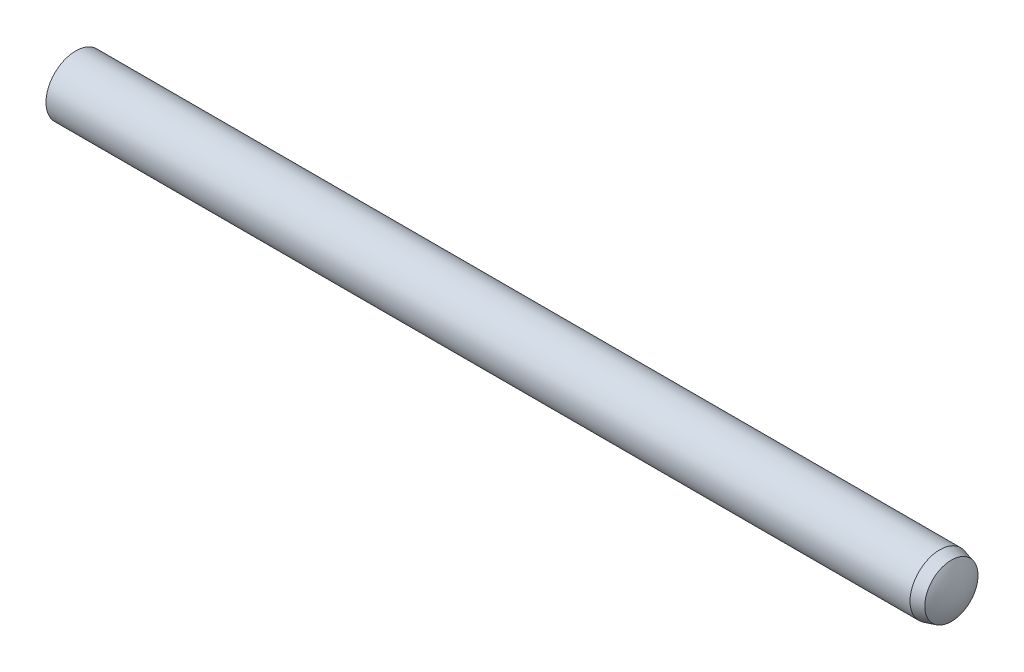
ISO-10303-21;
HEADER;
FILE_DESCRIPTION(('STEP AP214'),'2;1');
FILE_NAME('part.step','',(''),(''),'','','');
FILE_SCHEMA(('AUTOMOTIVE_DESIGN { 1 0 10303 214 1 1 1 1 }'));
ENDSEC;
DATA;
#1=APPLICATION_CONTEXT('core data for automotive mechanical design processes');
#2=APPLICATION_PROTOCOL_DEFINITION('international standard','automotive_design',2000,#1);
#3=PRODUCT_CONTEXT('',#1,'mechanical');
#4=PRODUCT('Part','Part','',(#3));
#5=PRODUCT_RELATED_PRODUCT_CATEGORY('part','',(#4));
#6=PRODUCT_DEFINITION_FORMATION('','',#4);
#7=PRODUCT_DEFINITION_CONTEXT('part definition',#1,'design');
#8=PRODUCT_DEFINITION('design','',#6,#7);
#9=PRODUCT_DEFINITION_SHAPE('','',#8);
#10=(LENGTH_UNIT() NAMED_UNIT(*) SI_UNIT(.MILLI.,.METRE.));
#11=(NAMED_UNIT(*) PLANE_ANGLE_UNIT() SI_UNIT($,.RADIAN.));
#12=(NAMED_UNIT(*) SI_UNIT($,.STERADIAN.) SOLID_ANGLE_UNIT());
#13=UNCERTAINTY_MEASURE_WITH_UNIT(LENGTH_MEASURE(1.E-05),#10,'distance_accuracy_value','');
#14=(GEOMETRIC_REPRESENTATION_CONTEXT(3) GLOBAL_UNCERTAINTY_ASSIGNED_CONTEXT((#13)) GLOBAL_UNIT_ASSIGNED_CONTEXT((#10,
#11,#12)) REPRESENTATION_CONTEXT('',''));
#15=CARTESIAN_POINT('',(0.,0.,0.));
#16=DIRECTION('',(0.,0.,1.));
#17=DIRECTION('',(1.,0.,0.));
#18=AXIS2_PLACEMENT_3D('',#15,#16,#17);
#19=CARTESIAN_POINT('',(-22.5,0.,0.));
#20=DIRECTION('',(1.,0.,0.));
#21=DIRECTION('',(0.,0.,-1.));
#22=AXIS2_PLACEMENT_3D('',#19,#20,#21);
#23=CYLINDRICAL_SURFACE('',#22,1.5);
#24=CARTESIAN_POINT('',(21.525,0.,0.));
#25=DIRECTION('',(-1.,0.,0.));
#26=DIRECTION('',(0.,0.,1.));
#27=AXIS2_PLACEMENT_3D('',#24,#25,#26);
#28=CIRCLE('',#27,1.5);
#29=CARTESIAN_POINT('',(21.525,0.,-1.5));
#30=VERTEX_POINT('',#29);
#31=EDGE_CURVE('E11',#30,#30,#28,.T.);
#32=CARTESIAN_POINT('',(-22.05,0.,0.));
#33=DIRECTION('',(-1.,0.,0.));
#34=DIRECTION('',(0.,0.,1.));
#35=AXIS2_PLACEMENT_3D('',#32,#33,#34);
#36=CIRCLE('',#35,1.5);
#37=CARTESIAN_POINT('',(-22.05,0.,-1.5));
#38=VERTEX_POINT('',#37);
#39=EDGE_CURVE('E52',#38,#38,#36,.T.);
#40=CARTESIAN_POINT('',(21.525,0.,-1.5));
#41=CARTESIAN_POINT('',(21.07109375,0.,-1.5));
#42=CARTESIAN_POINT('',(20.6171875,0.,-1.5));
#43=CARTESIAN_POINT('',(19.709375,0.,-1.5));
#44=CARTESIAN_POINT('',(19.25546875,0.,-1.5));
#45=CARTESIAN_POINT('',(18.34765625,0.,-1.5));
#46=CARTESIAN_POINT('',(17.89375,0.,-1.5));
#47=CARTESIAN_POINT('',(16.9859375,0.,-1.5));
#48=CARTESIAN_POINT('',(16.53203125,0.,-1.5));
#49=CARTESIAN_POINT('',(15.62421875,0.,-1.5));
#50=CARTESIAN_POINT('',(15.1703125,0.,-1.5));
#51=CARTESIAN_POINT('',(14.2625,0.,-1.5));
#52=CARTESIAN_POINT('',(13.80859375,0.,-1.5));
#53=CARTESIAN_POINT('',(12.90078125,0.,-1.5));
#54=CARTESIAN_POINT('',(12.446875,0.,-1.5));
#55=CARTESIAN_POINT('',(11.5390625,0.,-1.5));
#56=CARTESIAN_POINT('',(11.08515625,0.,-1.5));
#57=CARTESIAN_POINT('',(10.17734375,0.,-1.5));
#58=CARTESIAN_POINT('',(9.7234375,0.,-1.5));
#59=CARTESIAN_POINT('',(8.815625,0.,-1.5));
#60=CARTESIAN_POINT('',(8.36171875,0.,-1.5));
#61=CARTESIAN_POINT('',(7.45390625,0.,-1.5));
#62=CARTESIAN_POINT('',(7.,0.,-1.5));
#63=CARTESIAN_POINT('',(6.0921875,0.,-1.5));
#64=CARTESIAN_POINT('',(5.63828125,0.,-1.5));
#65=CARTESIAN_POINT('',(4.73046875,0.,-1.5));
#66=CARTESIAN_POINT('',(4.2765625,0.,-1.5));
#67=CARTESIAN_POINT('',(3.36875,0.,-1.5));
#68=CARTESIAN_POINT('',(2.91484375,0.,-1.5));
#69=CARTESIAN_POINT('',(2.00703125,0.,-1.5));
#70=CARTESIAN_POINT('',(1.553125,0.,-1.5));
#71=CARTESIAN_POINT('',(0.645312500000002,0.,-1.5));
#72=CARTESIAN_POINT('',(0.191406250000001,0.,-1.5));
#73=CARTESIAN_POINT('',(-0.716406249999999,0.,-1.5));
#74=CARTESIAN_POINT('',(-1.1703125,0.,-1.5));
#75=CARTESIAN_POINT('',(-2.078125,0.,-1.5));
#76=CARTESIAN_POINT('',(-2.53203125,0.,-1.5));
#77=CARTESIAN_POINT('',(-3.43984375,0.,-1.5));
#78=CARTESIAN_POINT('',(-3.89375,0.,-1.5));
#79=CARTESIAN_POINT('',(-4.8015625,0.,-1.5));
#80=CARTESIAN_POINT('',(-5.25546875,0.,-1.5));
#81=CARTESIAN_POINT('',(-6.16328125,0.,-1.5));
#82=CARTESIAN_POINT('',(-6.6171875,0.,-1.5));
#83=CARTESIAN_POINT('',(-7.525,0.,-1.5));
#84=CARTESIAN_POINT('',(-7.97890625,0.,-1.5));
#85=CARTESIAN_POINT('',(-8.88671875,0.,-1.5));
#86=CARTESIAN_POINT('',(-9.340625,0.,-1.5));
#87=CARTESIAN_POINT('',(-10.2484375,0.,-1.5));
#88=CARTESIAN_POINT('',(-10.70234375,0.,-1.5));
#89=CARTESIAN_POINT('',(-11.61015625,0.,-1.5));
#90=CARTESIAN_POINT('',(-12.0640625,0.,-1.5));
#91=CARTESIAN_POINT('',(-12.971875,0.,-1.5));
#92=CARTESIAN_POINT('',(-13.42578125,0.,-1.5));
#93=CARTESIAN_POINT('',(-14.33359375,0.,-1.5));
#94=CARTESIAN_POINT('',(-14.7875,0.,-1.5));
#95=CARTESIAN_POINT('',(-15.6953125,0.,-1.5));
#96=CARTESIAN_POINT('',(-16.14921875,0.,-1.5));
#97=CARTESIAN_POINT('',(-17.05703125,0.,-1.5));
#98=CARTESIAN_POINT('',(-17.5109375,0.,-1.5));
#99=CARTESIAN_POINT('',(-18.41875,0.,-1.5));
#100=CARTESIAN_POINT('',(-18.87265625,0.,-1.5));
#101=CARTESIAN_POINT('',(-19.78046875,0.,-1.5));
#102=CARTESIAN_POINT('',(-20.234375,0.,-1.5));
#103=CARTESIAN_POINT('',(-21.1421875,0.,-1.5));
#104=CARTESIAN_POINT('',(-21.59609375,0.,-1.5));
#105=CARTESIAN_POINT('',(-22.05,0.,-1.5));
#106=B_SPLINE_CURVE_WITH_KNOTS('',3,(#40,#41,#42,#43,#44,#45,#46,#47,#48,#49,#50,#51,#52,#53,
#54,#55,#56,#57,#58,#59,#60,#61,#62,#63,#64,#65,#66,#67,#68,#69,#70,#71,#72,#73,#74,#75,#76,#77,
#78,#79,#80,#81,#82,#83,#84,#85,#86,#87,#88,#89,#90,#91,#92,#93,#94,#95,#96,#97,#98,#99,#100,
#101,#102,#103,#104,#105),.UNSPECIFIED.,.F.,.F.,(4,2,2,2,2,2,2,2,2,2,2,2,2,2,2,2,2,2,2,2,2,2,2,
2,2,2,2,2,2,2,2,2,4),(0.,1.36171875,2.7234375,4.08515625,5.446875,6.80859375,8.1703125,
9.53203125,10.89375,12.25546875,13.6171875,14.97890625,16.340625,17.70234375,19.0640625,
20.42578125,21.7875,23.14921875,24.5109375,25.87265625,27.234375,28.59609375,29.9578125,
31.31953125,32.68125,34.04296875,35.4046875,36.76640625,38.128125,39.48984375,40.8515625,
42.21328125,43.575),.UNSPECIFIED.);
#107=EDGE_CURVE('BSEAM32',#30,#38,#106,.T.);
#108=ORIENTED_EDGE('',*,*,#31,.T.);
#109=ORIENTED_EDGE('',*,*,#39,.F.);
#110=ORIENTED_EDGE('',*,*,#107,.T.);
#111=ORIENTED_EDGE('',*,*,#107,.F.);
#112=EDGE_LOOP('',(#108,#110,#109,#111));
#113=FACE_BOUND('',#112,.T.);
#114=ADVANCED_FACE('F32',(#113),#23,.T.);
#115=CARTESIAN_POINT('',(21.525,0.,0.));
#116=DIRECTION('',(-1.,0.,0.));
#117=DIRECTION('',(0.,0.,1.));
#118=AXIS2_PLACEMENT_3D('',#115,#116,#117);
#119=CONICAL_SURFACE('',#118,1.5,0.261799387799153);
#120=CARTESIAN_POINT('',(22.11,0.,0.));
#121=DIRECTION('',(-1.,0.,0.));
#122=DIRECTION('',(0.,0.,1.));
#123=AXIS2_PLACEMENT_3D('',#120,#121,#122);
#124=CIRCLE('',#123,1.34324972242779);
#125=CARTESIAN_POINT('',(22.11,0.,1.34324972242779));
#126=VERTEX_POINT('',#125);
#127=EDGE_CURVE('E39',#126,#126,#124,.T.);
#128=ORIENTED_EDGE('',*,*,#127,.T.);
#129=EDGE_LOOP('',(#128));
#130=FACE_BOUND('',#129,.T.);
#131=ORIENTED_EDGE('',*,*,#31,.F.);
#132=EDGE_LOOP('',(#131));
#133=FACE_BOUND('',#132,.T.);
#134=ADVANCED_FACE('F58',(#130,#133),#119,.T.);
#135=CARTESIAN_POINT('',(19.9917694656381,0.,0.));
#136=DIRECTION('',(-1.,0.,0.));
#137=DIRECTION('',(0.,1.,0.));
#138=AXIS2_PLACEMENT_3D('',#135,#136,#137);
#139=SPHERICAL_SURFACE('',#138,2.50823053436193);
#140=CARTESIAN_POINT('',(22.5,0.,0.));
#141=VERTEX_POINT('',#140);
#142=VERTEX_LOOP('',#141);
#143=FACE_BOUND('',#142,.T.);
#144=ORIENTED_EDGE('',*,*,#127,.F.);
#145=EDGE_LOOP('',(#144));
#146=FACE_BOUND('',#145,.T.);
#147=ADVANCED_FACE('F48',(#143,#146),#139,.T.);
#148=CARTESIAN_POINT('',(-19.775,0.,0.));
#149=DIRECTION('',(-1.,0.,0.));
#150=DIRECTION('',(0.,-1.,0.));
#151=AXIS2_PLACEMENT_3D('',#148,#149,#150);
#152=SPHERICAL_SURFACE('',#151,2.725);
#153=CARTESIAN_POINT('',(-22.5,0.,0.));
#154=VERTEX_POINT('',#153);
#155=VERTEX_LOOP('',#154);
#156=FACE_BOUND('',#155,.T.);
#157=ORIENTED_EDGE('',*,*,#39,.T.);
#158=EDGE_LOOP('',(#157));
#159=FACE_BOUND('',#158,.T.);
#160=ADVANCED_FACE('F45',(#156,#159),#152,.T.);
#161=CLOSED_SHELL('',(#114,#134,#147,#160));
#162=MANIFOLD_SOLID_BREP('B2',#161);
#163=ADVANCED_BREP_SHAPE_REPRESENTATION('',(#18,#162),#14);
#164=SHAPE_DEFINITION_REPRESENTATION(#9,#163);
ENDSEC;
END-ISO-10303-21;
